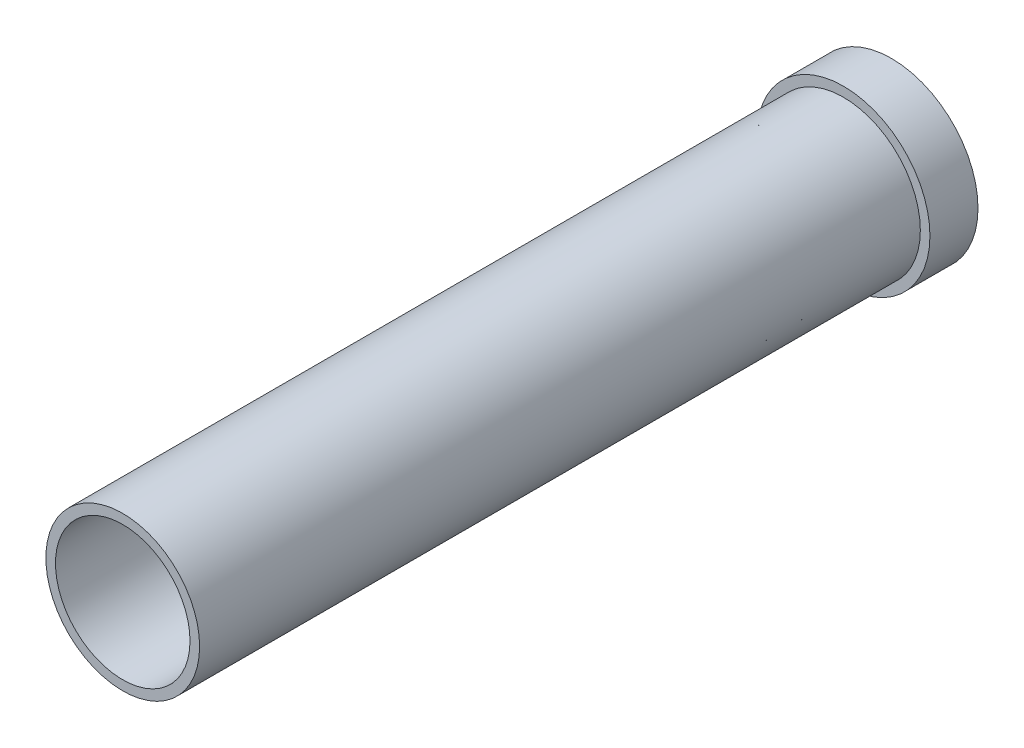
ISO-10303-21;
HEADER;
FILE_DESCRIPTION(('STEP AP214'),'2;1');
FILE_NAME('part.step','',(''),(''),'','','');
FILE_SCHEMA(('AUTOMOTIVE_DESIGN { 1 0 10303 214 1 1 1 1 }'));
ENDSEC;
DATA;
#1=APPLICATION_CONTEXT('core data for automotive mechanical design processes');
#2=APPLICATION_PROTOCOL_DEFINITION('international standard','automotive_design',2000,#1);
#3=PRODUCT_CONTEXT('',#1,'mechanical');
#4=PRODUCT('Part','Part','',(#3));
#5=PRODUCT_RELATED_PRODUCT_CATEGORY('part','',(#4));
#6=PRODUCT_DEFINITION_FORMATION('','',#4);
#7=PRODUCT_DEFINITION_CONTEXT('part definition',#1,'design');
#8=PRODUCT_DEFINITION('design','',#6,#7);
#9=PRODUCT_DEFINITION_SHAPE('','',#8);
#10=(LENGTH_UNIT() NAMED_UNIT(*) SI_UNIT(.MILLI.,.METRE.));
#11=(NAMED_UNIT(*) PLANE_ANGLE_UNIT() SI_UNIT($,.RADIAN.));
#12=(NAMED_UNIT(*) SI_UNIT($,.STERADIAN.) SOLID_ANGLE_UNIT());
#13=UNCERTAINTY_MEASURE_WITH_UNIT(LENGTH_MEASURE(1.E-05),#10,'distance_accuracy_value','');
#14=(GEOMETRIC_REPRESENTATION_CONTEXT(3) GLOBAL_UNCERTAINTY_ASSIGNED_CONTEXT((#13)) GLOBAL_UNIT_ASSIGNED_CONTEXT((#10,
#11,#12)) REPRESENTATION_CONTEXT('',''));
#15=CARTESIAN_POINT('',(0.,0.,0.));
#16=DIRECTION('',(0.,0.,1.));
#17=DIRECTION('',(1.,0.,0.));
#18=AXIS2_PLACEMENT_3D('',#15,#16,#17);
#19=CARTESIAN_POINT('',(0.,0.,5.));
#20=DIRECTION('',(0.,0.,1.));
#21=DIRECTION('',(1.,0.,0.));
#22=AXIS2_PLACEMENT_3D('',#19,#20,#21);
#23=PLANE('',#22);
#24=CARTESIAN_POINT('',(0.,0.,5.));
#25=DIRECTION('',(0.,0.,1.));
#26=DIRECTION('',(1.,0.,0.));
#27=AXIS2_PLACEMENT_3D('',#24,#25,#26);
#28=CIRCLE('',#27,8.);
#29=CARTESIAN_POINT('',(8.,0.,5.));
#30=VERTEX_POINT('',#29);
#31=EDGE_CURVE('E58',#30,#30,#28,.T.);
#32=ORIENTED_EDGE('',*,*,#31,.F.);
#33=EDGE_LOOP('',(#32));
#34=FACE_BOUND('',#33,.T.);
#35=CARTESIAN_POINT('',(0.,0.,5.));
#36=DIRECTION('',(0.,0.,1.));
#37=DIRECTION('',(1.,0.,0.));
#38=AXIS2_PLACEMENT_3D('',#35,#36,#37);
#39=CIRCLE('',#38,9.);
#40=CARTESIAN_POINT('',(9.,0.,5.));
#41=VERTEX_POINT('',#40);
#42=EDGE_CURVE('E69',#41,#41,#39,.T.);
#43=ORIENTED_EDGE('',*,*,#42,.T.);
#44=EDGE_LOOP('',(#43));
#45=FACE_BOUND('',#44,.T.);
#46=ADVANCED_FACE('F44',(#34,#45),#23,.T.);
#47=CARTESIAN_POINT('',(0.,0.,5.));
#48=DIRECTION('',(0.,0.,-1.));
#49=DIRECTION('',(-1.,0.,0.));
#50=AXIS2_PLACEMENT_3D('',#47,#48,#49);
#51=CYLINDRICAL_SURFACE('',#50,7.);
#52=CARTESIAN_POINT('',(0.,0.,2.));
#53=DIRECTION('',(0.,0.,1.));
#54=DIRECTION('',(1.,0.,0.));
#55=AXIS2_PLACEMENT_3D('',#52,#53,#54);
#56=CIRCLE('',#55,7.);
#57=CARTESIAN_POINT('',(7.,0.,2.));
#58=VERTEX_POINT('',#57);
#59=EDGE_CURVE('E11',#58,#58,#56,.F.);
#60=ORIENTED_EDGE('',*,*,#59,.T.);
#61=EDGE_LOOP('',(#60));
#62=FACE_BOUND('',#61,.T.);
#63=CARTESIAN_POINT('',(0.,0.,80.));
#64=DIRECTION('',(0.,0.,1.));
#65=DIRECTION('',(1.,0.,0.));
#66=AXIS2_PLACEMENT_3D('',#63,#64,#65);
#67=CIRCLE('',#66,7.);
#68=CARTESIAN_POINT('',(7.,0.,80.));
#69=VERTEX_POINT('',#68);
#70=EDGE_CURVE('E64',#69,#69,#67,.T.);
#71=ORIENTED_EDGE('',*,*,#70,.T.);
#72=EDGE_LOOP('',(#71));
#73=FACE_BOUND('',#72,.T.);
#74=ADVANCED_FACE('F92',(#62,#73),#51,.F.);
#75=CARTESIAN_POINT('',(0.,0.,80.));
#76=DIRECTION('',(0.,0.,1.));
#77=DIRECTION('',(1.,0.,0.));
#78=AXIS2_PLACEMENT_3D('',#75,#76,#77);
#79=PLANE('',#78);
#80=CARTESIAN_POINT('',(0.,0.,80.));
#81=DIRECTION('',(0.,0.,1.));
#82=DIRECTION('',(1.,0.,0.));
#83=AXIS2_PLACEMENT_3D('',#80,#81,#82);
#84=CIRCLE('',#83,8.);
#85=CARTESIAN_POINT('',(8.,0.,80.));
#86=VERTEX_POINT('',#85);
#87=EDGE_CURVE('E53',#86,#86,#84,.T.);
#88=ORIENTED_EDGE('',*,*,#87,.T.);
#89=EDGE_LOOP('',(#88));
#90=FACE_BOUND('',#89,.T.);
#91=ORIENTED_EDGE('',*,*,#70,.F.);
#92=EDGE_LOOP('',(#91));
#93=FACE_BOUND('',#92,.T.);
#94=ADVANCED_FACE('F98',(#90,#93),#79,.T.);
#95=CARTESIAN_POINT('',(0.,0.,80.));
#96=DIRECTION('',(0.,0.,-1.));
#97=DIRECTION('',(-1.,0.,0.));
#98=AXIS2_PLACEMENT_3D('',#95,#96,#97);
#99=CYLINDRICAL_SURFACE('',#98,8.);
#100=ORIENTED_EDGE('',*,*,#87,.F.);
#101=EDGE_LOOP('',(#100));
#102=FACE_BOUND('',#101,.T.);
#103=ORIENTED_EDGE('',*,*,#31,.T.);
#104=EDGE_LOOP('',(#103));
#105=FACE_BOUND('',#104,.T.);
#106=ADVANCED_FACE('F87',(#102,#105),#99,.T.);
#107=CARTESIAN_POINT('',(0.,0.,0.));
#108=DIRECTION('',(0.,0.,-1.));
#109=DIRECTION('',(-1.,0.,0.));
#110=AXIS2_PLACEMENT_3D('',#107,#108,#109);
#111=CONICAL_SURFACE('',#110,8.99999999999999,0.785398163397444);
#112=ORIENTED_EDGE('',*,*,#59,.F.);
#113=EDGE_LOOP('',(#112));
#114=FACE_BOUND('',#113,.T.);
#115=CARTESIAN_POINT('',(0.,0.,0.));
#116=DIRECTION('',(0.,0.,-1.));
#117=DIRECTION('',(-1.,0.,0.));
#118=AXIS2_PLACEMENT_3D('',#115,#116,#117);
#119=CIRCLE('',#118,9.);
#120=CARTESIAN_POINT('',(-9.,0.,0.));
#121=VERTEX_POINT('',#120);
#122=EDGE_CURVE('E73',#121,#121,#119,.T.);
#123=ORIENTED_EDGE('',*,*,#122,.T.);
#124=EDGE_LOOP('',(#123));
#125=FACE_BOUND('',#124,.T.);
#126=ADVANCED_FACE('F47',(#114,#125),#111,.F.);
#127=CARTESIAN_POINT('',(0.,0.,10.));
#128=DIRECTION('',(0.,0.,-1.));
#129=DIRECTION('',(-1.,0.,0.));
#130=AXIS2_PLACEMENT_3D('',#127,#128,#129);
#131=CYLINDRICAL_SURFACE('',#130,9.);
#132=ORIENTED_EDGE('',*,*,#42,.F.);
#133=EDGE_LOOP('',(#132));
#134=FACE_BOUND('',#133,.T.);
#135=ORIENTED_EDGE('',*,*,#122,.F.);
#136=EDGE_LOOP('',(#135));
#137=FACE_BOUND('',#136,.T.);
#138=ADVANCED_FACE('F79',(#134,#137),#131,.T.);
#139=CLOSED_SHELL('',(#46,#74,#94,#106,#126,#138));
#140=MANIFOLD_SOLID_BREP('B2',#139);
#141=ADVANCED_BREP_SHAPE_REPRESENTATION('',(#18,#140),#14);
#142=SHAPE_DEFINITION_REPRESENTATION(#9,#141);
ENDSEC;
END-ISO-10303-21;
